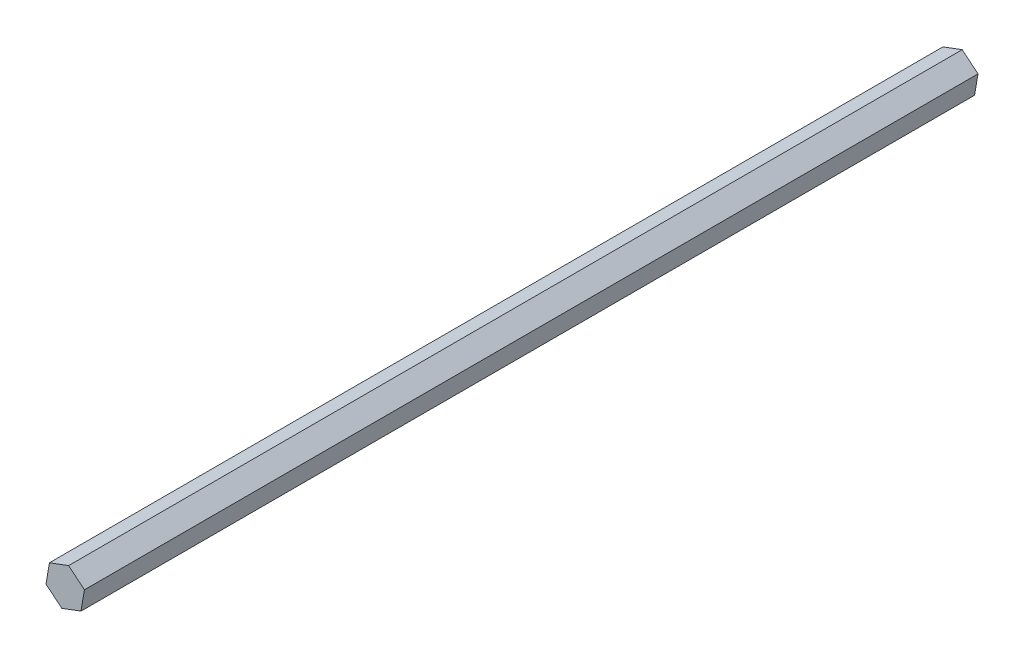
ISO-10303-21;
HEADER;
FILE_DESCRIPTION(('STEP AP214'),'2;1');
FILE_NAME('part.step','',(''),(''),'','','');
FILE_SCHEMA(('AUTOMOTIVE_DESIGN { 1 0 10303 214 1 1 1 1 }'));
ENDSEC;
DATA;
#1=APPLICATION_CONTEXT('core data for automotive mechanical design processes');
#2=APPLICATION_PROTOCOL_DEFINITION('international standard','automotive_design',2000,#1);
#3=PRODUCT_CONTEXT('',#1,'mechanical');
#4=PRODUCT('Part','Part','',(#3));
#5=PRODUCT_RELATED_PRODUCT_CATEGORY('part','',(#4));
#6=PRODUCT_DEFINITION_FORMATION('','',#4);
#7=PRODUCT_DEFINITION_CONTEXT('part definition',#1,'design');
#8=PRODUCT_DEFINITION('design','',#6,#7);
#9=PRODUCT_DEFINITION_SHAPE('','',#8);
#10=(LENGTH_UNIT() NAMED_UNIT(*) SI_UNIT(.MILLI.,.METRE.));
#11=(NAMED_UNIT(*) PLANE_ANGLE_UNIT() SI_UNIT($,.RADIAN.));
#12=(NAMED_UNIT(*) SI_UNIT($,.STERADIAN.) SOLID_ANGLE_UNIT());
#13=UNCERTAINTY_MEASURE_WITH_UNIT(LENGTH_MEASURE(1.E-05),#10,'distance_accuracy_value','');
#14=(GEOMETRIC_REPRESENTATION_CONTEXT(3) GLOBAL_UNCERTAINTY_ASSIGNED_CONTEXT((#13)) GLOBAL_UNIT_ASSIGNED_CONTEXT((#10,
#11,#12)) REPRESENTATION_CONTEXT('',''));
#15=CARTESIAN_POINT('',(0.,0.,0.));
#16=DIRECTION('',(0.,0.,1.));
#17=DIRECTION('',(1.,0.,0.));
#18=AXIS2_PLACEMENT_3D('',#15,#16,#17);
#19=CARTESIAN_POINT('',(-0.688821128579145,-4.07017920811311,180.));
#20=DIRECTION('',(-0.348482083819925,0.937315441703871,0.));
#21=DIRECTION('',(-0.937315441703871,-0.348482083819925,0.));
#22=AXIS2_PLACEMENT_3D('',#19,#20,#21);
#23=PLANE('',#22);
#24=DIRECTION('',(0.937315441703871,0.348482083819925,0.));
#25=VECTOR('',#24,1.);
#26=CARTESIAN_POINT('',(-0.688821128579145,-4.07017920811311,0.));
#27=LINE('',#26,#25);
#28=CARTESIAN_POINT('',(-0.688821128579145,-4.07017920811311,0.));
#29=VERTEX_POINT('',#28);
#30=CARTESIAN_POINT('',(3.18046802789161,-2.63162620006956,0.));
#31=VERTEX_POINT('',#30);
#32=EDGE_CURVE('E123',#29,#31,#27,.T.);
#33=ORIENTED_EDGE('',*,*,#32,.T.);
#34=DIRECTION('',(0.,0.,-1.));
#35=VECTOR('',#34,1.);
#36=CARTESIAN_POINT('',(3.18046802789161,-2.63162620006956,180.));
#37=LINE('',#36,#35);
#38=CARTESIAN_POINT('',(3.18046802789161,-2.63162620006956,180.));
#39=VERTEX_POINT('',#38);
#40=EDGE_CURVE('E11',#39,#31,#37,.T.);
#41=ORIENTED_EDGE('',*,*,#40,.F.);
#42=DIRECTION('',(0.937315441703871,0.348482083819925,0.));
#43=VECTOR('',#42,1.);
#44=CARTESIAN_POINT('',(-0.688821128579145,-4.07017920811311,180.));
#45=LINE('',#44,#43);
#46=CARTESIAN_POINT('',(-0.688821128579145,-4.07017920811311,180.));
#47=VERTEX_POINT('',#46);
#48=EDGE_CURVE('E133',#47,#39,#45,.T.);
#49=ORIENTED_EDGE('',*,*,#48,.F.);
#50=DIRECTION('',(0.,0.,-1.));
#51=VECTOR('',#50,1.);
#52=CARTESIAN_POINT('',(-0.688821128579145,-4.07017920811311,180.));
#53=LINE('',#52,#51);
#54=EDGE_CURVE('E119',#47,#29,#53,.T.);
#55=ORIENTED_EDGE('',*,*,#54,.T.);
#56=EDGE_LOOP('',(#33,#41,#49,#55));
#57=FACE_BOUND('',#56,.T.);
#58=ADVANCED_FACE('F39',(#57),#23,.F.);
#59=CARTESIAN_POINT('',(3.18046802789161,-2.63162620006956,180.));
#60=DIRECTION('',(-0.985980025784947,0.166863383500142,0.));
#61=DIRECTION('',(-0.166863383500142,-0.985980025784947,0.));
#62=AXIS2_PLACEMENT_3D('',#59,#60,#61);
#63=PLANE('',#62);
#64=DIRECTION('',(0.166863383500142,0.985980025784947,0.));
#65=VECTOR('',#64,1.);
#66=CARTESIAN_POINT('',(3.18046802789161,-2.63162620006956,0.));
#67=LINE('',#66,#65);
#68=CARTESIAN_POINT('',(3.86928915647076,1.43855300804355,0.));
#69=VERTEX_POINT('',#68);
#70=EDGE_CURVE('E126',#31,#69,#67,.T.);
#71=ORIENTED_EDGE('',*,*,#70,.T.);
#72=DIRECTION('',(0.,0.,-1.));
#73=VECTOR('',#72,1.);
#74=CARTESIAN_POINT('',(3.86928915647076,1.43855300804355,180.));
#75=LINE('',#74,#73);
#76=CARTESIAN_POINT('',(3.86928915647076,1.43855300804355,180.));
#77=VERTEX_POINT('',#76);
#78=EDGE_CURVE('E47',#77,#69,#75,.T.);
#79=ORIENTED_EDGE('',*,*,#78,.F.);
#80=DIRECTION('',(0.166863383500142,0.985980025784947,0.));
#81=VECTOR('',#80,1.);
#82=CARTESIAN_POINT('',(3.18046802789161,-2.63162620006956,180.));
#83=LINE('',#82,#81);
#84=EDGE_CURVE('E92',#39,#77,#83,.T.);
#85=ORIENTED_EDGE('',*,*,#84,.F.);
#86=ORIENTED_EDGE('',*,*,#40,.T.);
#87=EDGE_LOOP('',(#71,#79,#85,#86));
#88=FACE_BOUND('',#87,.T.);
#89=ADVANCED_FACE('F157',(#88),#63,.F.);
#90=CARTESIAN_POINT('',(3.86928915647076,1.43855300804355,180.));
#91=DIRECTION('',(-0.637497941965021,-0.770452058203729,0.));
#92=DIRECTION('',(0.770452058203729,-0.637497941965021,0.));
#93=AXIS2_PLACEMENT_3D('',#90,#91,#92);
#94=PLANE('',#93);
#95=DIRECTION('',(-0.770452058203729,0.637497941965021,0.));
#96=VECTOR('',#95,1.);
#97=CARTESIAN_POINT('',(3.86928915647076,1.43855300804355,0.));
#98=LINE('',#97,#96);
#99=CARTESIAN_POINT('',(0.688821128579147,4.07017920811311,0.));
#100=VERTEX_POINT('',#99);
#101=EDGE_CURVE('E128',#69,#100,#98,.T.);
#102=ORIENTED_EDGE('',*,*,#101,.T.);
#103=DIRECTION('',(0.,0.,-1.));
#104=VECTOR('',#103,1.);
#105=CARTESIAN_POINT('',(0.688821128579147,4.07017920811311,180.));
#106=LINE('',#105,#104);
#107=CARTESIAN_POINT('',(0.688821128579147,4.07017920811311,180.));
#108=VERTEX_POINT('',#107);
#109=EDGE_CURVE('E114',#108,#100,#106,.T.);
#110=ORIENTED_EDGE('',*,*,#109,.F.);
#111=DIRECTION('',(-0.770452058203729,0.637497941965021,0.));
#112=VECTOR('',#111,1.);
#113=CARTESIAN_POINT('',(3.86928915647076,1.43855300804355,180.));
#114=LINE('',#113,#112);
#115=EDGE_CURVE('E105',#77,#108,#114,.T.);
#116=ORIENTED_EDGE('',*,*,#115,.F.);
#117=ORIENTED_EDGE('',*,*,#78,.T.);
#118=EDGE_LOOP('',(#102,#110,#116,#117));
#119=FACE_BOUND('',#118,.T.);
#120=ADVANCED_FACE('F139',(#119),#94,.F.);
#121=CARTESIAN_POINT('',(0.688821128579147,4.07017920811311,180.));
#122=DIRECTION('',(0.348482083819925,-0.937315441703871,0.));
#123=DIRECTION('',(0.937315441703871,0.348482083819925,0.));
#124=AXIS2_PLACEMENT_3D('',#121,#122,#123);
#125=PLANE('',#124);
#126=DIRECTION('',(-0.937315441703871,-0.348482083819925,0.));
#127=VECTOR('',#126,1.);
#128=CARTESIAN_POINT('',(0.688821128579147,4.07017920811311,0.));
#129=LINE('',#128,#127);
#130=CARTESIAN_POINT('',(-3.18046802789161,2.63162620006956,0.));
#131=VERTEX_POINT('',#130);
#132=EDGE_CURVE('E113',#100,#131,#129,.T.);
#133=ORIENTED_EDGE('',*,*,#132,.T.);
#134=DIRECTION('',(0.,0.,-1.));
#135=VECTOR('',#134,1.);
#136=CARTESIAN_POINT('',(-3.18046802789161,2.63162620006956,180.));
#137=LINE('',#136,#135);
#138=CARTESIAN_POINT('',(-3.18046802789161,2.63162620006956,180.));
#139=VERTEX_POINT('',#138);
#140=EDGE_CURVE('E110',#139,#131,#137,.T.);
#141=ORIENTED_EDGE('',*,*,#140,.F.);
#142=DIRECTION('',(-0.937315441703871,-0.348482083819925,0.));
#143=VECTOR('',#142,1.);
#144=CARTESIAN_POINT('',(0.688821128579147,4.07017920811311,180.));
#145=LINE('',#144,#143);
#146=EDGE_CURVE('E99',#108,#139,#145,.T.);
#147=ORIENTED_EDGE('',*,*,#146,.F.);
#148=ORIENTED_EDGE('',*,*,#109,.T.);
#149=EDGE_LOOP('',(#133,#141,#147,#148));
#150=FACE_BOUND('',#149,.T.);
#151=ADVANCED_FACE('F111',(#150),#125,.F.);
#152=CARTESIAN_POINT('',(-3.18046802789161,2.63162620006956,180.));
#153=DIRECTION('',(0.985980025784947,-0.166863383500142,0.));
#154=DIRECTION('',(0.166863383500142,0.985980025784947,0.));
#155=AXIS2_PLACEMENT_3D('',#152,#153,#154);
#156=PLANE('',#155);
#157=DIRECTION('',(-0.166863383500142,-0.985980025784947,0.));
#158=VECTOR('',#157,1.);
#159=CARTESIAN_POINT('',(-3.18046802789161,2.63162620006956,0.));
#160=LINE('',#159,#158);
#161=CARTESIAN_POINT('',(-3.86928915647076,-1.43855300804355,0.));
#162=VERTEX_POINT('',#161);
#163=EDGE_CURVE('E78',#131,#162,#160,.T.);
#164=ORIENTED_EDGE('',*,*,#163,.T.);
#165=DIRECTION('',(0.,0.,-1.));
#166=VECTOR('',#165,1.);
#167=CARTESIAN_POINT('',(-3.86928915647076,-1.43855300804355,180.));
#168=LINE('',#167,#166);
#169=CARTESIAN_POINT('',(-3.86928915647076,-1.43855300804355,180.));
#170=VERTEX_POINT('',#169);
#171=EDGE_CURVE('E115',#170,#162,#168,.T.);
#172=ORIENTED_EDGE('',*,*,#171,.F.);
#173=DIRECTION('',(-0.166863383500142,-0.985980025784947,0.));
#174=VECTOR('',#173,1.);
#175=CARTESIAN_POINT('',(-3.18046802789161,2.63162620006956,180.));
#176=LINE('',#175,#174);
#177=EDGE_CURVE('E103',#139,#170,#176,.T.);
#178=ORIENTED_EDGE('',*,*,#177,.F.);
#179=ORIENTED_EDGE('',*,*,#140,.T.);
#180=EDGE_LOOP('',(#164,#172,#178,#179));
#181=FACE_BOUND('',#180,.T.);
#182=ADVANCED_FACE('F117',(#181),#156,.F.);
#183=CARTESIAN_POINT('',(-3.86928915647076,-1.43855300804355,180.));
#184=DIRECTION('',(0.637497941965021,0.770452058203729,0.));
#185=DIRECTION('',(-0.770452058203729,0.637497941965022,0.));
#186=AXIS2_PLACEMENT_3D('',#183,#184,#185);
#187=PLANE('',#186);
#188=DIRECTION('',(0.770452058203729,-0.637497941965021,0.));
#189=VECTOR('',#188,1.);
#190=CARTESIAN_POINT('',(-3.86928915647076,-1.43855300804355,0.));
#191=LINE('',#190,#189);
#192=EDGE_CURVE('E84',#162,#29,#191,.T.);
#193=ORIENTED_EDGE('',*,*,#192,.T.);
#194=ORIENTED_EDGE('',*,*,#54,.F.);
#195=DIRECTION('',(0.770452058203729,-0.637497941965021,0.));
#196=VECTOR('',#195,1.);
#197=CARTESIAN_POINT('',(-3.86928915647076,-1.43855300804355,180.));
#198=LINE('',#197,#196);
#199=EDGE_CURVE('E55',#170,#47,#198,.T.);
#200=ORIENTED_EDGE('',*,*,#199,.F.);
#201=ORIENTED_EDGE('',*,*,#171,.T.);
#202=EDGE_LOOP('',(#193,#194,#200,#201));
#203=FACE_BOUND('',#202,.T.);
#204=ADVANCED_FACE('F146',(#203),#187,.F.);
#205=CARTESIAN_POINT('',(0.,0.,180.));
#206=DIRECTION('',(0.,0.,1.));
#207=DIRECTION('',(1.,0.,0.));
#208=AXIS2_PLACEMENT_3D('',#205,#206,#207);
#209=PLANE('',#208);
#210=ORIENTED_EDGE('',*,*,#48,.T.);
#211=ORIENTED_EDGE('',*,*,#84,.T.);
#212=ORIENTED_EDGE('',*,*,#115,.T.);
#213=ORIENTED_EDGE('',*,*,#146,.T.);
#214=ORIENTED_EDGE('',*,*,#177,.T.);
#215=ORIENTED_EDGE('',*,*,#199,.T.);
#216=EDGE_LOOP('',(#210,#211,#212,#213,#214,#215));
#217=FACE_BOUND('',#216,.T.);
#218=ADVANCED_FACE('F101',(#217),#209,.T.);
#219=CARTESIAN_POINT('',(0.,0.,0.));
#220=DIRECTION('',(0.,0.,1.));
#221=DIRECTION('',(1.,0.,0.));
#222=AXIS2_PLACEMENT_3D('',#219,#220,#221);
#223=PLANE('',#222);
#224=ORIENTED_EDGE('',*,*,#32,.F.);
#225=ORIENTED_EDGE('',*,*,#192,.F.);
#226=ORIENTED_EDGE('',*,*,#163,.F.);
#227=ORIENTED_EDGE('',*,*,#132,.F.);
#228=ORIENTED_EDGE('',*,*,#101,.F.);
#229=ORIENTED_EDGE('',*,*,#70,.F.);
#230=EDGE_LOOP('',(#224,#225,#226,#227,#228,#229));
#231=FACE_BOUND('',#230,.T.);
#232=ADVANCED_FACE('F142',(#231),#223,.F.);
#233=CLOSED_SHELL('',(#58,#89,#120,#151,#182,#204,#218,#232));
#234=MANIFOLD_SOLID_BREP('B2',#233);
#235=ADVANCED_BREP_SHAPE_REPRESENTATION('',(#18,#234),#14);
#236=SHAPE_DEFINITION_REPRESENTATION(#9,#235);
ENDSEC;
END-ISO-10303-21;
